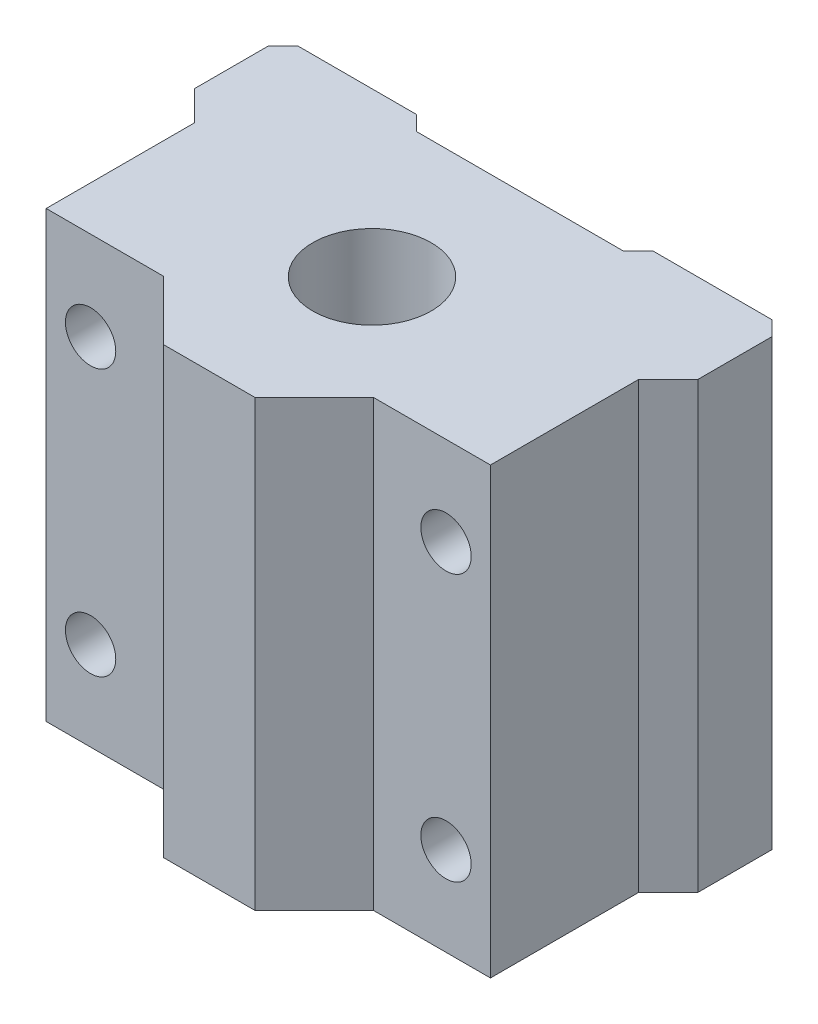
ISO-10303-21;
HEADER;
FILE_DESCRIPTION(('STEP AP214'),'2;1');
FILE_NAME('part.step','',(''),(''),'','','');
FILE_SCHEMA(('AUTOMOTIVE_DESIGN { 1 0 10303 214 1 1 1 1 }'));
ENDSEC;
DATA;
#1=APPLICATION_CONTEXT('core data for automotive mechanical design processes');
#2=APPLICATION_PROTOCOL_DEFINITION('international standard','automotive_design',2000,#1);
#3=PRODUCT_CONTEXT('',#1,'mechanical');
#4=PRODUCT('Part','Part','',(#3));
#5=PRODUCT_RELATED_PRODUCT_CATEGORY('part','',(#4));
#6=PRODUCT_DEFINITION_FORMATION('','',#4);
#7=PRODUCT_DEFINITION_CONTEXT('part definition',#1,'design');
#8=PRODUCT_DEFINITION('design','',#6,#7);
#9=PRODUCT_DEFINITION_SHAPE('','',#8);
#10=(LENGTH_UNIT() NAMED_UNIT(*) SI_UNIT(.MILLI.,.METRE.));
#11=(NAMED_UNIT(*) PLANE_ANGLE_UNIT() SI_UNIT($,.RADIAN.));
#12=(NAMED_UNIT(*) SI_UNIT($,.STERADIAN.) SOLID_ANGLE_UNIT());
#13=UNCERTAINTY_MEASURE_WITH_UNIT(LENGTH_MEASURE(1.E-05),#10,'distance_accuracy_value','');
#14=(GEOMETRIC_REPRESENTATION_CONTEXT(3) GLOBAL_UNCERTAINTY_ASSIGNED_CONTEXT((#13)) GLOBAL_UNIT_ASSIGNED_CONTEXT((#10,
#11,#12)) REPRESENTATION_CONTEXT('',''));
#15=CARTESIAN_POINT('',(0.,0.,0.));
#16=DIRECTION('',(0.,0.,1.));
#17=DIRECTION('',(1.,0.,0.));
#18=AXIS2_PLACEMENT_3D('',#15,#16,#17);
#19=CARTESIAN_POINT('',(0.,30.,0.));
#20=DIRECTION('',(0.,1.,0.));
#21=DIRECTION('',(0.,0.,1.));
#22=AXIS2_PLACEMENT_3D('',#19,#20,#21);
#23=PLANE('',#22);
#24=DIRECTION('',(-0.707106781186547,0.,-0.707106781186548));
#25=VECTOR('',#24,1.);
#26=CARTESIAN_POINT('',(-7.,30.,-10.));
#27=LINE('',#26,#25);
#28=CARTESIAN_POINT('',(-7.,30.,-10.));
#29=VERTEX_POINT('',#28);
#30=CARTESIAN_POINT('',(-8.,30.,-11.));
#31=VERTEX_POINT('',#30);
#32=EDGE_CURVE('E231',#29,#31,#27,.T.);
#33=ORIENTED_EDGE('',*,*,#32,.T.);
#34=DIRECTION('',(-1.,0.,0.));
#35=VECTOR('',#34,1.);
#36=CARTESIAN_POINT('',(-8.,30.,-11.));
#37=LINE('',#36,#35);
#38=CARTESIAN_POINT('',(-16.,30.,-11.));
#39=VERTEX_POINT('',#38);
#40=EDGE_CURVE('E129',#31,#39,#37,.T.);
#41=ORIENTED_EDGE('',*,*,#40,.T.);
#42=DIRECTION('',(-0.707106781186546,0.,0.707106781186549));
#43=VECTOR('',#42,1.);
#44=CARTESIAN_POINT('',(-16.,30.,-11.));
#45=LINE('',#44,#43);
#46=CARTESIAN_POINT('',(-17.,30.,-10.));
#47=VERTEX_POINT('',#46);
#48=EDGE_CURVE('E276',#39,#47,#45,.T.);
#49=ORIENTED_EDGE('',*,*,#48,.T.);
#50=DIRECTION('',(0.,0.,1.));
#51=VECTOR('',#50,1.);
#52=CARTESIAN_POINT('',(-17.,30.,-10.));
#53=LINE('',#52,#51);
#54=CARTESIAN_POINT('',(-17.,30.,-5.));
#55=VERTEX_POINT('',#54);
#56=EDGE_CURVE('E295',#47,#55,#53,.T.);
#57=ORIENTED_EDGE('',*,*,#56,.T.);
#58=DIRECTION('',(0.707106781186549,0.,0.707106781186546));
#59=VECTOR('',#58,1.);
#60=CARTESIAN_POINT('',(-17.,30.,-5.));
#61=LINE('',#60,#59);
#62=CARTESIAN_POINT('',(-15.,30.,-3.));
#63=VERTEX_POINT('',#62);
#64=EDGE_CURVE('E292',#55,#63,#61,.T.);
#65=ORIENTED_EDGE('',*,*,#64,.T.);
#66=DIRECTION('',(0.,0.,1.));
#67=VECTOR('',#66,1.);
#68=CARTESIAN_POINT('',(-15.,30.,-3.));
#69=LINE('',#68,#67);
#70=CARTESIAN_POINT('',(-15.,30.,7.));
#71=VERTEX_POINT('',#70);
#72=EDGE_CURVE('E294',#63,#71,#69,.T.);
#73=ORIENTED_EDGE('',*,*,#72,.T.);
#74=DIRECTION('',(1.,0.,0.));
#75=VECTOR('',#74,1.);
#76=CARTESIAN_POINT('',(-15.,30.,7.));
#77=LINE('',#76,#75);
#78=CARTESIAN_POINT('',(-7.09128506130848,30.,7.));
#79=VERTEX_POINT('',#78);
#80=EDGE_CURVE('E297',#71,#79,#77,.T.);
#81=ORIENTED_EDGE('',*,*,#80,.T.);
#82=DIRECTION('',(0.707106781186546,0.,0.707106781186549));
#83=VECTOR('',#82,1.);
#84=CARTESIAN_POINT('',(-7.09128506130848,30.,7.));
#85=LINE('',#84,#83);
#86=CARTESIAN_POINT('',(-3.0912850613085,30.,11.));
#87=VERTEX_POINT('',#86);
#88=EDGE_CURVE('E303',#79,#87,#85,.T.);
#89=ORIENTED_EDGE('',*,*,#88,.T.);
#90=DIRECTION('',(1.,0.,0.));
#91=VECTOR('',#90,1.);
#92=CARTESIAN_POINT('',(3.0912850613085,30.,11.));
#93=LINE('',#92,#91);
#94=CARTESIAN_POINT('',(3.0912850613085,30.,11.));
#95=VERTEX_POINT('',#94);
#96=EDGE_CURVE('E305',#87,#95,#93,.T.);
#97=ORIENTED_EDGE('',*,*,#96,.T.);
#98=DIRECTION('',(0.707106781186546,0.,-0.707106781186549));
#99=VECTOR('',#98,1.);
#100=CARTESIAN_POINT('',(7.09128506130848,30.,7.));
#101=LINE('',#100,#99);
#102=CARTESIAN_POINT('',(7.09128506130848,30.,7.));
#103=VERTEX_POINT('',#102);
#104=EDGE_CURVE('E307',#95,#103,#101,.T.);
#105=ORIENTED_EDGE('',*,*,#104,.T.);
#106=DIRECTION('',(1.,0.,0.));
#107=VECTOR('',#106,1.);
#108=CARTESIAN_POINT('',(15.,30.,7.));
#109=LINE('',#108,#107);
#110=CARTESIAN_POINT('',(15.,30.,7.));
#111=VERTEX_POINT('',#110);
#112=EDGE_CURVE('E309',#103,#111,#109,.T.);
#113=ORIENTED_EDGE('',*,*,#112,.T.);
#114=DIRECTION('',(0.,0.,-1.));
#115=VECTOR('',#114,1.);
#116=CARTESIAN_POINT('',(15.,30.,-3.));
#117=LINE('',#116,#115);
#118=CARTESIAN_POINT('',(15.,30.,-3.));
#119=VERTEX_POINT('',#118);
#120=EDGE_CURVE('E311',#111,#119,#117,.T.);
#121=ORIENTED_EDGE('',*,*,#120,.T.);
#122=DIRECTION('',(0.707106781186548,0.,-0.707106781186547));
#123=VECTOR('',#122,1.);
#124=CARTESIAN_POINT('',(17.,30.,-5.));
#125=LINE('',#124,#123);
#126=CARTESIAN_POINT('',(17.,30.,-5.));
#127=VERTEX_POINT('',#126);
#128=EDGE_CURVE('E313',#119,#127,#125,.T.);
#129=ORIENTED_EDGE('',*,*,#128,.T.);
#130=DIRECTION('',(0.,0.,-1.));
#131=VECTOR('',#130,1.);
#132=CARTESIAN_POINT('',(17.,30.,-10.));
#133=LINE('',#132,#131);
#134=CARTESIAN_POINT('',(17.,30.,-10.));
#135=VERTEX_POINT('',#134);
#136=EDGE_CURVE('E315',#127,#135,#133,.T.);
#137=ORIENTED_EDGE('',*,*,#136,.T.);
#138=DIRECTION('',(-0.707106781186546,0.,-0.707106781186549));
#139=VECTOR('',#138,1.);
#140=CARTESIAN_POINT('',(16.,30.,-11.));
#141=LINE('',#140,#139);
#142=CARTESIAN_POINT('',(16.,30.,-11.));
#143=VERTEX_POINT('',#142);
#144=EDGE_CURVE('E178',#135,#143,#141,.T.);
#145=ORIENTED_EDGE('',*,*,#144,.T.);
#146=DIRECTION('',(-1.,0.,0.));
#147=VECTOR('',#146,1.);
#148=CARTESIAN_POINT('',(8.,30.,-11.));
#149=LINE('',#148,#147);
#150=CARTESIAN_POINT('',(8.,30.,-11.));
#151=VERTEX_POINT('',#150);
#152=EDGE_CURVE('E172',#143,#151,#149,.T.);
#153=ORIENTED_EDGE('',*,*,#152,.T.);
#154=DIRECTION('',(-0.707106781186547,0.,0.707106781186548));
#155=VECTOR('',#154,1.);
#156=CARTESIAN_POINT('',(7.,30.,-10.));
#157=LINE('',#156,#155);
#158=CARTESIAN_POINT('',(7.,30.,-10.));
#159=VERTEX_POINT('',#158);
#160=EDGE_CURVE('E176',#151,#159,#157,.T.);
#161=ORIENTED_EDGE('',*,*,#160,.T.);
#162=DIRECTION('',(-1.,0.,0.));
#163=VECTOR('',#162,1.);
#164=CARTESIAN_POINT('',(-7.,30.,-10.));
#165=LINE('',#164,#163);
#166=EDGE_CURVE('E56',#159,#29,#165,.T.);
#167=ORIENTED_EDGE('',*,*,#166,.T.);
#168=EDGE_LOOP('',(#33,#41,#49,#57,#65,#73,#81,#89,#97,#105,#113,#121,#129,#137,#145,#153,#161,#167));
#169=FACE_BOUND('',#168,.T.);
#170=CARTESIAN_POINT('',(0.,30.,0.));
#171=DIRECTION('',(0.,1.,0.));
#172=DIRECTION('',(0.,0.,1.));
#173=AXIS2_PLACEMENT_3D('',#170,#171,#172);
#174=CIRCLE('',#173,4.);
#175=CARTESIAN_POINT('',(0.,30.,4.));
#176=VERTEX_POINT('',#175);
#177=EDGE_CURVE('E200',#176,#176,#174,.T.);
#178=ORIENTED_EDGE('',*,*,#177,.F.);
#179=EDGE_LOOP('',(#178));
#180=FACE_BOUND('',#179,.T.);
#181=ADVANCED_FACE('F39',(#169,#180),#23,.T.);
#182=CARTESIAN_POINT('',(0.,0.,0.));
#183=DIRECTION('',(0.,1.,0.));
#184=DIRECTION('',(0.,0.,1.));
#185=AXIS2_PLACEMENT_3D('',#182,#183,#184);
#186=PLANE('',#185);
#187=DIRECTION('',(-0.707106781186547,0.,-0.707106781186548));
#188=VECTOR('',#187,1.);
#189=CARTESIAN_POINT('',(-7.,0.,-10.));
#190=LINE('',#189,#188);
#191=CARTESIAN_POINT('',(-7.,0.,-10.));
#192=VERTEX_POINT('',#191);
#193=CARTESIAN_POINT('',(-8.,0.,-11.));
#194=VERTEX_POINT('',#193);
#195=EDGE_CURVE('E196',#192,#194,#190,.T.);
#196=ORIENTED_EDGE('',*,*,#195,.F.);
#197=DIRECTION('',(-1.,0.,0.));
#198=VECTOR('',#197,1.);
#199=CARTESIAN_POINT('',(-7.,0.,-10.));
#200=LINE('',#199,#198);
#201=CARTESIAN_POINT('',(7.,0.,-10.));
#202=VERTEX_POINT('',#201);
#203=EDGE_CURVE('E121',#202,#192,#200,.T.);
#204=ORIENTED_EDGE('',*,*,#203,.F.);
#205=DIRECTION('',(-0.707106781186547,0.,0.707106781186548));
#206=VECTOR('',#205,1.);
#207=CARTESIAN_POINT('',(7.,0.,-10.));
#208=LINE('',#207,#206);
#209=CARTESIAN_POINT('',(8.,0.,-11.));
#210=VERTEX_POINT('',#209);
#211=EDGE_CURVE('E115',#210,#202,#208,.T.);
#212=ORIENTED_EDGE('',*,*,#211,.F.);
#213=DIRECTION('',(-1.,0.,0.));
#214=VECTOR('',#213,1.);
#215=CARTESIAN_POINT('',(8.,0.,-11.));
#216=LINE('',#215,#214);
#217=CARTESIAN_POINT('',(16.,0.,-11.));
#218=VERTEX_POINT('',#217);
#219=EDGE_CURVE('E186',#218,#210,#216,.T.);
#220=ORIENTED_EDGE('',*,*,#219,.F.);
#221=DIRECTION('',(-0.707106781186546,0.,-0.707106781186549));
#222=VECTOR('',#221,1.);
#223=CARTESIAN_POINT('',(16.,0.,-11.));
#224=LINE('',#223,#222);
#225=CARTESIAN_POINT('',(17.,0.,-10.));
#226=VERTEX_POINT('',#225);
#227=EDGE_CURVE('E226',#226,#218,#224,.T.);
#228=ORIENTED_EDGE('',*,*,#227,.F.);
#229=DIRECTION('',(0.,0.,-1.));
#230=VECTOR('',#229,1.);
#231=CARTESIAN_POINT('',(17.,0.,-10.));
#232=LINE('',#231,#230);
#233=CARTESIAN_POINT('',(17.,0.,-5.));
#234=VERTEX_POINT('',#233);
#235=EDGE_CURVE('E224',#234,#226,#232,.T.);
#236=ORIENTED_EDGE('',*,*,#235,.F.);
#237=DIRECTION('',(0.707106781186548,0.,-0.707106781186547));
#238=VECTOR('',#237,1.);
#239=CARTESIAN_POINT('',(17.,0.,-5.));
#240=LINE('',#239,#238);
#241=CARTESIAN_POINT('',(15.,0.,-3.));
#242=VERTEX_POINT('',#241);
#243=EDGE_CURVE('E222',#242,#234,#240,.T.);
#244=ORIENTED_EDGE('',*,*,#243,.F.);
#245=DIRECTION('',(0.,0.,-1.));
#246=VECTOR('',#245,1.);
#247=CARTESIAN_POINT('',(15.,0.,-3.));
#248=LINE('',#247,#246);
#249=CARTESIAN_POINT('',(15.,0.,7.));
#250=VERTEX_POINT('',#249);
#251=EDGE_CURVE('E220',#250,#242,#248,.T.);
#252=ORIENTED_EDGE('',*,*,#251,.F.);
#253=DIRECTION('',(1.,0.,0.));
#254=VECTOR('',#253,1.);
#255=CARTESIAN_POINT('',(15.,0.,7.));
#256=LINE('',#255,#254);
#257=CARTESIAN_POINT('',(7.09128506130848,0.,7.));
#258=VERTEX_POINT('',#257);
#259=EDGE_CURVE('E218',#258,#250,#256,.T.);
#260=ORIENTED_EDGE('',*,*,#259,.F.);
#261=DIRECTION('',(0.707106781186546,0.,-0.707106781186549));
#262=VECTOR('',#261,1.);
#263=CARTESIAN_POINT('',(7.09128506130848,0.,7.));
#264=LINE('',#263,#262);
#265=CARTESIAN_POINT('',(3.0912850613085,0.,11.));
#266=VERTEX_POINT('',#265);
#267=EDGE_CURVE('E216',#266,#258,#264,.T.);
#268=ORIENTED_EDGE('',*,*,#267,.F.);
#269=DIRECTION('',(1.,0.,0.));
#270=VECTOR('',#269,1.);
#271=CARTESIAN_POINT('',(3.0912850613085,0.,11.));
#272=LINE('',#271,#270);
#273=CARTESIAN_POINT('',(-3.0912850613085,0.,11.));
#274=VERTEX_POINT('',#273);
#275=EDGE_CURVE('E214',#274,#266,#272,.T.);
#276=ORIENTED_EDGE('',*,*,#275,.F.);
#277=DIRECTION('',(0.707106781186546,0.,0.707106781186549));
#278=VECTOR('',#277,1.);
#279=CARTESIAN_POINT('',(-7.09128506130848,0.,7.));
#280=LINE('',#279,#278);
#281=CARTESIAN_POINT('',(-7.09128506130848,0.,7.));
#282=VERTEX_POINT('',#281);
#283=EDGE_CURVE('E212',#282,#274,#280,.T.);
#284=ORIENTED_EDGE('',*,*,#283,.F.);
#285=DIRECTION('',(1.,0.,0.));
#286=VECTOR('',#285,1.);
#287=CARTESIAN_POINT('',(-15.,0.,7.));
#288=LINE('',#287,#286);
#289=CARTESIAN_POINT('',(-15.,0.,7.));
#290=VERTEX_POINT('',#289);
#291=EDGE_CURVE('E210',#290,#282,#288,.T.);
#292=ORIENTED_EDGE('',*,*,#291,.F.);
#293=DIRECTION('',(0.,0.,1.));
#294=VECTOR('',#293,1.);
#295=CARTESIAN_POINT('',(-15.,0.,-3.));
#296=LINE('',#295,#294);
#297=CARTESIAN_POINT('',(-15.,0.,-3.));
#298=VERTEX_POINT('',#297);
#299=EDGE_CURVE('E208',#298,#290,#296,.T.);
#300=ORIENTED_EDGE('',*,*,#299,.F.);
#301=DIRECTION('',(0.707106781186549,0.,0.707106781186546));
#302=VECTOR('',#301,1.);
#303=CARTESIAN_POINT('',(-17.,0.,-5.));
#304=LINE('',#303,#302);
#305=CARTESIAN_POINT('',(-17.,0.,-5.));
#306=VERTEX_POINT('',#305);
#307=EDGE_CURVE('E206',#306,#298,#304,.T.);
#308=ORIENTED_EDGE('',*,*,#307,.F.);
#309=DIRECTION('',(0.,0.,1.));
#310=VECTOR('',#309,1.);
#311=CARTESIAN_POINT('',(-17.,0.,-10.));
#312=LINE('',#311,#310);
#313=CARTESIAN_POINT('',(-17.,0.,-10.));
#314=VERTEX_POINT('',#313);
#315=EDGE_CURVE('E204',#314,#306,#312,.T.);
#316=ORIENTED_EDGE('',*,*,#315,.F.);
#317=DIRECTION('',(-0.707106781186546,0.,0.707106781186549));
#318=VECTOR('',#317,1.);
#319=CARTESIAN_POINT('',(-16.,0.,-11.));
#320=LINE('',#319,#318);
#321=CARTESIAN_POINT('',(-16.,0.,-11.));
#322=VERTEX_POINT('',#321);
#323=EDGE_CURVE('E202',#322,#314,#320,.T.);
#324=ORIENTED_EDGE('',*,*,#323,.F.);
#325=DIRECTION('',(-1.,0.,0.));
#326=VECTOR('',#325,1.);
#327=CARTESIAN_POINT('',(-8.,0.,-11.));
#328=LINE('',#327,#326);
#329=EDGE_CURVE('E199',#194,#322,#328,.T.);
#330=ORIENTED_EDGE('',*,*,#329,.F.);
#331=EDGE_LOOP('',(#196,#204,#212,#220,#228,#236,#244,#252,#260,#268,#276,#284,#292,#300,#308,
#316,#324,#330));
#332=FACE_BOUND('',#331,.T.);
#333=CARTESIAN_POINT('',(0.,0.,0.));
#334=DIRECTION('',(0.,1.,0.));
#335=DIRECTION('',(0.,0.,1.));
#336=AXIS2_PLACEMENT_3D('',#333,#334,#335);
#337=CIRCLE('',#336,4.);
#338=CARTESIAN_POINT('',(0.,0.,4.));
#339=VERTEX_POINT('',#338);
#340=EDGE_CURVE('E393',#339,#339,#337,.T.);
#341=ORIENTED_EDGE('',*,*,#340,.T.);
#342=EDGE_LOOP('',(#341));
#343=FACE_BOUND('',#342,.T.);
#344=ADVANCED_FACE('F280',(#332,#343),#186,.F.);
#345=CARTESIAN_POINT('',(-7.,30.,-10.));
#346=DIRECTION('',(-0.707106781186548,0.,0.707106781186547));
#347=DIRECTION('',(0.707106781186547,0.,0.707106781186548));
#348=AXIS2_PLACEMENT_3D('',#345,#346,#347);
#349=PLANE('',#348);
#350=ORIENTED_EDGE('',*,*,#195,.T.);
#351=DIRECTION('',(0.,-1.,0.));
#352=VECTOR('',#351,1.);
#353=CARTESIAN_POINT('',(-8.,30.,-11.));
#354=LINE('',#353,#352);
#355=EDGE_CURVE('E11',#31,#194,#354,.T.);
#356=ORIENTED_EDGE('',*,*,#355,.F.);
#357=ORIENTED_EDGE('',*,*,#32,.F.);
#358=DIRECTION('',(0.,-1.,0.));
#359=VECTOR('',#358,1.);
#360=CARTESIAN_POINT('',(-7.,30.,-10.));
#361=LINE('',#360,#359);
#362=EDGE_CURVE('E192',#29,#192,#361,.T.);
#363=ORIENTED_EDGE('',*,*,#362,.T.);
#364=EDGE_LOOP('',(#350,#356,#357,#363));
#365=FACE_BOUND('',#364,.T.);
#366=ADVANCED_FACE('F41',(#365),#349,.F.);
#367=CARTESIAN_POINT('',(-8.,30.,-11.));
#368=DIRECTION('',(0.,0.,1.));
#369=DIRECTION('',(1.,0.,0.));
#370=AXIS2_PLACEMENT_3D('',#367,#368,#369);
#371=PLANE('',#370);
#372=CARTESIAN_POINT('',(-11.9999999999716,5.99999999999999,-11.));
#373=DIRECTION('',(0.,0.,1.));
#374=DIRECTION('',(1.,0.,0.));
#375=AXIS2_PLACEMENT_3D('',#372,#373,#374);
#376=CIRCLE('',#375,1.7);
#377=CARTESIAN_POINT('',(-10.2999999999716,5.99999999999999,-11.));
#378=VERTEX_POINT('',#377);
#379=EDGE_CURVE('E372',#378,#378,#376,.F.);
#380=ORIENTED_EDGE('',*,*,#379,.F.);
#381=EDGE_LOOP('',(#380));
#382=FACE_BOUND('',#381,.T.);
#383=CARTESIAN_POINT('',(-11.9999999999716,24.,-11.));
#384=DIRECTION('',(0.,0.,1.));
#385=DIRECTION('',(1.,0.,0.));
#386=AXIS2_PLACEMENT_3D('',#383,#384,#385);
#387=CIRCLE('',#386,1.7);
#388=CARTESIAN_POINT('',(-10.2999999999716,24.,-11.));
#389=VERTEX_POINT('',#388);
#390=EDGE_CURVE('E367',#389,#389,#387,.F.);
#391=ORIENTED_EDGE('',*,*,#390,.F.);
#392=EDGE_LOOP('',(#391));
#393=FACE_BOUND('',#392,.T.);
#394=ORIENTED_EDGE('',*,*,#329,.T.);
#395=DIRECTION('',(0.,-1.,0.));
#396=VECTOR('',#395,1.);
#397=CARTESIAN_POINT('',(-16.,30.,-11.));
#398=LINE('',#397,#396);
#399=EDGE_CURVE('E48',#39,#322,#398,.T.);
#400=ORIENTED_EDGE('',*,*,#399,.F.);
#401=ORIENTED_EDGE('',*,*,#40,.F.);
#402=ORIENTED_EDGE('',*,*,#355,.T.);
#403=EDGE_LOOP('',(#394,#400,#401,#402));
#404=FACE_BOUND('',#403,.T.);
#405=ADVANCED_FACE('F453',(#382,#393,#404),#371,.F.);
#406=CARTESIAN_POINT('',(-16.,30.,-11.));
#407=DIRECTION('',(0.707106781186549,0.,0.707106781186546));
#408=DIRECTION('',(0.707106781186546,0.,-0.707106781186549));
#409=AXIS2_PLACEMENT_3D('',#406,#407,#408);
#410=PLANE('',#409);
#411=ORIENTED_EDGE('',*,*,#323,.T.);
#412=DIRECTION('',(0.,-1.,0.));
#413=VECTOR('',#412,1.);
#414=CARTESIAN_POINT('',(-17.,30.,-10.));
#415=LINE('',#414,#413);
#416=EDGE_CURVE('E268',#47,#314,#415,.T.);
#417=ORIENTED_EDGE('',*,*,#416,.F.);
#418=ORIENTED_EDGE('',*,*,#48,.F.);
#419=ORIENTED_EDGE('',*,*,#399,.T.);
#420=EDGE_LOOP('',(#411,#417,#418,#419));
#421=FACE_BOUND('',#420,.T.);
#422=ADVANCED_FACE('F274',(#421),#410,.F.);
#423=CARTESIAN_POINT('',(-17.,30.,-10.));
#424=DIRECTION('',(1.,0.,0.));
#425=DIRECTION('',(0.,0.,-1.));
#426=AXIS2_PLACEMENT_3D('',#423,#424,#425);
#427=PLANE('',#426);
#428=ORIENTED_EDGE('',*,*,#315,.T.);
#429=DIRECTION('',(0.,-1.,0.));
#430=VECTOR('',#429,1.);
#431=CARTESIAN_POINT('',(-17.,30.,-5.));
#432=LINE('',#431,#430);
#433=EDGE_CURVE('E265',#55,#306,#432,.T.);
#434=ORIENTED_EDGE('',*,*,#433,.F.);
#435=ORIENTED_EDGE('',*,*,#56,.F.);
#436=ORIENTED_EDGE('',*,*,#416,.T.);
#437=EDGE_LOOP('',(#428,#434,#435,#436));
#438=FACE_BOUND('',#437,.T.);
#439=ADVANCED_FACE('F286',(#438),#427,.F.);
#440=CARTESIAN_POINT('',(-17.,30.,-5.));
#441=DIRECTION('',(0.707106781186546,0.,-0.707106781186549));
#442=DIRECTION('',(-0.707106781186549,0.,-0.707106781186546));
#443=AXIS2_PLACEMENT_3D('',#440,#441,#442);
#444=PLANE('',#443);
#445=ORIENTED_EDGE('',*,*,#307,.T.);
#446=DIRECTION('',(0.,-1.,0.));
#447=VECTOR('',#446,1.);
#448=CARTESIAN_POINT('',(-15.,30.,-3.));
#449=LINE('',#448,#447);
#450=EDGE_CURVE('E262',#63,#298,#449,.T.);
#451=ORIENTED_EDGE('',*,*,#450,.F.);
#452=ORIENTED_EDGE('',*,*,#64,.F.);
#453=ORIENTED_EDGE('',*,*,#433,.T.);
#454=EDGE_LOOP('',(#445,#451,#452,#453));
#455=FACE_BOUND('',#454,.T.);
#456=ADVANCED_FACE('F290',(#455),#444,.F.);
#457=CARTESIAN_POINT('',(-15.,30.,-3.));
#458=DIRECTION('',(1.,0.,0.));
#459=DIRECTION('',(0.,0.,-1.));
#460=AXIS2_PLACEMENT_3D('',#457,#458,#459);
#461=PLANE('',#460);
#462=ORIENTED_EDGE('',*,*,#299,.T.);
#463=DIRECTION('',(0.,-1.,0.));
#464=VECTOR('',#463,1.);
#465=CARTESIAN_POINT('',(-15.,30.,7.));
#466=LINE('',#465,#464);
#467=EDGE_CURVE('E259',#71,#290,#466,.T.);
#468=ORIENTED_EDGE('',*,*,#467,.F.);
#469=ORIENTED_EDGE('',*,*,#72,.F.);
#470=ORIENTED_EDGE('',*,*,#450,.T.);
#471=EDGE_LOOP('',(#462,#468,#469,#470));
#472=FACE_BOUND('',#471,.T.);
#473=ADVANCED_FACE('F443',(#472),#461,.F.);
#474=CARTESIAN_POINT('',(-15.,30.,7.));
#475=DIRECTION('',(0.,0.,-1.));
#476=DIRECTION('',(-1.,0.,0.));
#477=AXIS2_PLACEMENT_3D('',#474,#475,#476);
#478=PLANE('',#477);
#479=CARTESIAN_POINT('',(-11.9999999999716,5.99999999999999,7.));
#480=DIRECTION('',(0.,0.,1.));
#481=DIRECTION('',(1.,0.,0.));
#482=AXIS2_PLACEMENT_3D('',#479,#480,#481);
#483=CIRCLE('',#482,1.7);
#484=CARTESIAN_POINT('',(-10.2999999999716,5.99999999999999,7.));
#485=VERTEX_POINT('',#484);
#486=EDGE_CURVE('E377',#485,#485,#483,.T.);
#487=ORIENTED_EDGE('',*,*,#486,.F.);
#488=EDGE_LOOP('',(#487));
#489=FACE_BOUND('',#488,.T.);
#490=CARTESIAN_POINT('',(-11.9999999999716,24.,7.));
#491=DIRECTION('',(0.,0.,1.));
#492=DIRECTION('',(-1.,0.,0.));
#493=AXIS2_PLACEMENT_3D('',#490,#491,#492);
#494=CIRCLE('',#493,1.7);
#495=CARTESIAN_POINT('',(-13.6999999999716,24.,7.));
#496=VERTEX_POINT('',#495);
#497=EDGE_CURVE('E370',#496,#496,#494,.T.);
#498=ORIENTED_EDGE('',*,*,#497,.F.);
#499=EDGE_LOOP('',(#498));
#500=FACE_BOUND('',#499,.T.);
#501=ORIENTED_EDGE('',*,*,#291,.T.);
#502=DIRECTION('',(0.,-1.,0.));
#503=VECTOR('',#502,1.);
#504=CARTESIAN_POINT('',(-7.09128506130848,30.,7.));
#505=LINE('',#504,#503);
#506=EDGE_CURVE('E256',#79,#282,#505,.T.);
#507=ORIENTED_EDGE('',*,*,#506,.F.);
#508=ORIENTED_EDGE('',*,*,#80,.F.);
#509=ORIENTED_EDGE('',*,*,#467,.T.);
#510=EDGE_LOOP('',(#501,#507,#508,#509));
#511=FACE_BOUND('',#510,.T.);
#512=ADVANCED_FACE('F439',(#489,#500,#511),#478,.F.);
#513=CARTESIAN_POINT('',(-7.09128506130848,30.,7.));
#514=DIRECTION('',(0.707106781186549,0.,-0.707106781186546));
#515=DIRECTION('',(-0.707106781186546,0.,-0.707106781186549));
#516=AXIS2_PLACEMENT_3D('',#513,#514,#515);
#517=PLANE('',#516);
#518=ORIENTED_EDGE('',*,*,#283,.T.);
#519=DIRECTION('',(0.,-1.,0.));
#520=VECTOR('',#519,1.);
#521=CARTESIAN_POINT('',(-3.0912850613085,30.,11.));
#522=LINE('',#521,#520);
#523=EDGE_CURVE('E253',#87,#274,#522,.T.);
#524=ORIENTED_EDGE('',*,*,#523,.F.);
#525=ORIENTED_EDGE('',*,*,#88,.F.);
#526=ORIENTED_EDGE('',*,*,#506,.T.);
#527=EDGE_LOOP('',(#518,#524,#525,#526));
#528=FACE_BOUND('',#527,.T.);
#529=ADVANCED_FACE('F435',(#528),#517,.F.);
#530=CARTESIAN_POINT('',(3.0912850613085,30.,11.));
#531=DIRECTION('',(0.,0.,-1.));
#532=DIRECTION('',(-1.,0.,0.));
#533=AXIS2_PLACEMENT_3D('',#530,#531,#532);
#534=PLANE('',#533);
#535=ORIENTED_EDGE('',*,*,#275,.T.);
#536=DIRECTION('',(0.,-1.,0.));
#537=VECTOR('',#536,1.);
#538=CARTESIAN_POINT('',(3.0912850613085,30.,11.));
#539=LINE('',#538,#537);
#540=EDGE_CURVE('E250',#95,#266,#539,.T.);
#541=ORIENTED_EDGE('',*,*,#540,.F.);
#542=ORIENTED_EDGE('',*,*,#96,.F.);
#543=ORIENTED_EDGE('',*,*,#523,.T.);
#544=EDGE_LOOP('',(#535,#541,#542,#543));
#545=FACE_BOUND('',#544,.T.);
#546=ADVANCED_FACE('F431',(#545),#534,.F.);
#547=CARTESIAN_POINT('',(7.09128506130848,30.,7.));
#548=DIRECTION('',(-0.707106781186549,0.,-0.707106781186546));
#549=DIRECTION('',(-0.707106781186546,0.,0.707106781186549));
#550=AXIS2_PLACEMENT_3D('',#547,#548,#549);
#551=PLANE('',#550);
#552=ORIENTED_EDGE('',*,*,#267,.T.);
#553=DIRECTION('',(0.,-1.,0.));
#554=VECTOR('',#553,1.);
#555=CARTESIAN_POINT('',(7.09128506130848,30.,7.));
#556=LINE('',#555,#554);
#557=EDGE_CURVE('E247',#103,#258,#556,.T.);
#558=ORIENTED_EDGE('',*,*,#557,.F.);
#559=ORIENTED_EDGE('',*,*,#104,.F.);
#560=ORIENTED_EDGE('',*,*,#540,.T.);
#561=EDGE_LOOP('',(#552,#558,#559,#560));
#562=FACE_BOUND('',#561,.T.);
#563=ADVANCED_FACE('F427',(#562),#551,.F.);
#564=CARTESIAN_POINT('',(15.,30.,7.));
#565=DIRECTION('',(0.,0.,-1.));
#566=DIRECTION('',(-1.,0.,0.));
#567=AXIS2_PLACEMENT_3D('',#564,#565,#566);
#568=PLANE('',#567);
#569=CARTESIAN_POINT('',(12.0000000000284,6.,7.));
#570=DIRECTION('',(0.,0.,1.));
#571=DIRECTION('',(-1.,0.,0.));
#572=AXIS2_PLACEMENT_3D('',#569,#570,#571);
#573=CIRCLE('',#572,1.7);
#574=CARTESIAN_POINT('',(10.3000000000284,6.,7.));
#575=VERTEX_POINT('',#574);
#576=EDGE_CURVE('E383',#575,#575,#573,.T.);
#577=ORIENTED_EDGE('',*,*,#576,.F.);
#578=EDGE_LOOP('',(#577));
#579=FACE_BOUND('',#578,.T.);
#580=CARTESIAN_POINT('',(12.0000000000284,24.,7.));
#581=DIRECTION('',(0.,0.,1.));
#582=DIRECTION('',(1.,0.,0.));
#583=AXIS2_PLACEMENT_3D('',#580,#581,#582);
#584=CIRCLE('',#583,1.7);
#585=CARTESIAN_POINT('',(13.7000000000284,24.,7.));
#586=VERTEX_POINT('',#585);
#587=EDGE_CURVE('E374',#586,#586,#584,.T.);
#588=ORIENTED_EDGE('',*,*,#587,.F.);
#589=EDGE_LOOP('',(#588));
#590=FACE_BOUND('',#589,.T.);
#591=ORIENTED_EDGE('',*,*,#259,.T.);
#592=DIRECTION('',(0.,-1.,0.));
#593=VECTOR('',#592,1.);
#594=CARTESIAN_POINT('',(15.,30.,7.));
#595=LINE('',#594,#593);
#596=EDGE_CURVE('E244',#111,#250,#595,.T.);
#597=ORIENTED_EDGE('',*,*,#596,.F.);
#598=ORIENTED_EDGE('',*,*,#112,.F.);
#599=ORIENTED_EDGE('',*,*,#557,.T.);
#600=EDGE_LOOP('',(#591,#597,#598,#599));
#601=FACE_BOUND('',#600,.T.);
#602=ADVANCED_FACE('F423',(#579,#590,#601),#568,.F.);
#603=CARTESIAN_POINT('',(15.,30.,-3.));
#604=DIRECTION('',(-1.,0.,0.));
#605=DIRECTION('',(0.,0.,1.));
#606=AXIS2_PLACEMENT_3D('',#603,#604,#605);
#607=PLANE('',#606);
#608=ORIENTED_EDGE('',*,*,#251,.T.);
#609=DIRECTION('',(0.,-1.,0.));
#610=VECTOR('',#609,1.);
#611=CARTESIAN_POINT('',(15.,30.,-3.));
#612=LINE('',#611,#610);
#613=EDGE_CURVE('E241',#119,#242,#612,.T.);
#614=ORIENTED_EDGE('',*,*,#613,.F.);
#615=ORIENTED_EDGE('',*,*,#120,.F.);
#616=ORIENTED_EDGE('',*,*,#596,.T.);
#617=EDGE_LOOP('',(#608,#614,#615,#616));
#618=FACE_BOUND('',#617,.T.);
#619=ADVANCED_FACE('F419',(#618),#607,.F.);
#620=CARTESIAN_POINT('',(17.,30.,-5.));
#621=DIRECTION('',(-0.707106781186547,0.,-0.707106781186548));
#622=DIRECTION('',(-0.707106781186548,0.,0.707106781186547));
#623=AXIS2_PLACEMENT_3D('',#620,#621,#622);
#624=PLANE('',#623);
#625=ORIENTED_EDGE('',*,*,#243,.T.);
#626=DIRECTION('',(0.,-1.,0.));
#627=VECTOR('',#626,1.);
#628=CARTESIAN_POINT('',(17.,30.,-5.));
#629=LINE('',#628,#627);
#630=EDGE_CURVE('E238',#127,#234,#629,.T.);
#631=ORIENTED_EDGE('',*,*,#630,.F.);
#632=ORIENTED_EDGE('',*,*,#128,.F.);
#633=ORIENTED_EDGE('',*,*,#613,.T.);
#634=EDGE_LOOP('',(#625,#631,#632,#633));
#635=FACE_BOUND('',#634,.T.);
#636=ADVANCED_FACE('F416',(#635),#624,.F.);
#637=CARTESIAN_POINT('',(17.,30.,-10.));
#638=DIRECTION('',(-1.,0.,0.));
#639=DIRECTION('',(0.,0.,1.));
#640=AXIS2_PLACEMENT_3D('',#637,#638,#639);
#641=PLANE('',#640);
#642=ORIENTED_EDGE('',*,*,#235,.T.);
#643=DIRECTION('',(0.,-1.,0.));
#644=VECTOR('',#643,1.);
#645=CARTESIAN_POINT('',(17.,30.,-10.));
#646=LINE('',#645,#644);
#647=EDGE_CURVE('E235',#135,#226,#646,.T.);
#648=ORIENTED_EDGE('',*,*,#647,.F.);
#649=ORIENTED_EDGE('',*,*,#136,.F.);
#650=ORIENTED_EDGE('',*,*,#630,.T.);
#651=EDGE_LOOP('',(#642,#648,#649,#650));
#652=FACE_BOUND('',#651,.T.);
#653=ADVANCED_FACE('F321',(#652),#641,.F.);
#654=CARTESIAN_POINT('',(16.,30.,-11.));
#655=DIRECTION('',(-0.707106781186549,0.,0.707106781186546));
#656=DIRECTION('',(0.707106781186546,0.,0.707106781186549));
#657=AXIS2_PLACEMENT_3D('',#654,#655,#656);
#658=PLANE('',#657);
#659=ORIENTED_EDGE('',*,*,#227,.T.);
#660=DIRECTION('',(0.,-1.,0.));
#661=VECTOR('',#660,1.);
#662=CARTESIAN_POINT('',(16.,30.,-11.));
#663=LINE('',#662,#661);
#664=EDGE_CURVE('E187',#143,#218,#663,.T.);
#665=ORIENTED_EDGE('',*,*,#664,.F.);
#666=ORIENTED_EDGE('',*,*,#144,.F.);
#667=ORIENTED_EDGE('',*,*,#647,.T.);
#668=EDGE_LOOP('',(#659,#665,#666,#667));
#669=FACE_BOUND('',#668,.T.);
#670=ADVANCED_FACE('F325',(#669),#658,.F.);
#671=CARTESIAN_POINT('',(8.,30.,-11.));
#672=DIRECTION('',(0.,0.,1.));
#673=DIRECTION('',(1.,0.,0.));
#674=AXIS2_PLACEMENT_3D('',#671,#672,#673);
#675=PLANE('',#674);
#676=CARTESIAN_POINT('',(12.0000000000284,6.,-11.));
#677=DIRECTION('',(0.,0.,1.));
#678=DIRECTION('',(1.,0.,0.));
#679=AXIS2_PLACEMENT_3D('',#676,#677,#678);
#680=CIRCLE('',#679,1.7);
#681=CARTESIAN_POINT('',(13.7000000000284,6.,-11.));
#682=VERTEX_POINT('',#681);
#683=EDGE_CURVE('E381',#682,#682,#680,.F.);
#684=ORIENTED_EDGE('',*,*,#683,.F.);
#685=EDGE_LOOP('',(#684));
#686=FACE_BOUND('',#685,.T.);
#687=CARTESIAN_POINT('',(12.0000000000284,24.,-11.));
#688=DIRECTION('',(0.,0.,1.));
#689=DIRECTION('',(1.,0.,0.));
#690=AXIS2_PLACEMENT_3D('',#687,#688,#689);
#691=CIRCLE('',#690,1.7);
#692=CARTESIAN_POINT('',(13.7000000000284,24.,-11.));
#693=VERTEX_POINT('',#692);
#694=EDGE_CURVE('E390',#693,#693,#691,.F.);
#695=ORIENTED_EDGE('',*,*,#694,.F.);
#696=EDGE_LOOP('',(#695));
#697=FACE_BOUND('',#696,.T.);
#698=ORIENTED_EDGE('',*,*,#219,.T.);
#699=DIRECTION('',(0.,-1.,0.));
#700=VECTOR('',#699,1.);
#701=CARTESIAN_POINT('',(8.,30.,-11.));
#702=LINE('',#701,#700);
#703=EDGE_CURVE('E183',#151,#210,#702,.T.);
#704=ORIENTED_EDGE('',*,*,#703,.F.);
#705=ORIENTED_EDGE('',*,*,#152,.F.);
#706=ORIENTED_EDGE('',*,*,#664,.T.);
#707=EDGE_LOOP('',(#698,#704,#705,#706));
#708=FACE_BOUND('',#707,.T.);
#709=ADVANCED_FACE('F184',(#686,#697,#708),#675,.F.);
#710=CARTESIAN_POINT('',(7.,30.,-10.));
#711=DIRECTION('',(0.707106781186548,0.,0.707106781186547));
#712=DIRECTION('',(0.707106781186547,0.,-0.707106781186548));
#713=AXIS2_PLACEMENT_3D('',#710,#711,#712);
#714=PLANE('',#713);
#715=ORIENTED_EDGE('',*,*,#211,.T.);
#716=DIRECTION('',(0.,-1.,0.));
#717=VECTOR('',#716,1.);
#718=CARTESIAN_POINT('',(7.,30.,-10.));
#719=LINE('',#718,#717);
#720=EDGE_CURVE('E188',#159,#202,#719,.T.);
#721=ORIENTED_EDGE('',*,*,#720,.F.);
#722=ORIENTED_EDGE('',*,*,#160,.F.);
#723=ORIENTED_EDGE('',*,*,#703,.T.);
#724=EDGE_LOOP('',(#715,#721,#722,#723));
#725=FACE_BOUND('',#724,.T.);
#726=ADVANCED_FACE('F190',(#725),#714,.F.);
#727=CARTESIAN_POINT('',(-7.,30.,-10.));
#728=DIRECTION('',(0.,0.,1.));
#729=DIRECTION('',(1.,0.,0.));
#730=AXIS2_PLACEMENT_3D('',#727,#728,#729);
#731=PLANE('',#730);
#732=ORIENTED_EDGE('',*,*,#203,.T.);
#733=ORIENTED_EDGE('',*,*,#362,.F.);
#734=ORIENTED_EDGE('',*,*,#166,.F.);
#735=ORIENTED_EDGE('',*,*,#720,.T.);
#736=EDGE_LOOP('',(#732,#733,#734,#735));
#737=FACE_BOUND('',#736,.T.);
#738=ADVANCED_FACE('F329',(#737),#731,.F.);
#739=CARTESIAN_POINT('',(0.,30.,0.));
#740=DIRECTION('',(0.,-1.,0.));
#741=DIRECTION('',(0.,0.,-1.));
#742=AXIS2_PLACEMENT_3D('',#739,#740,#741);
#743=CYLINDRICAL_SURFACE('',#742,4.);
#744=ORIENTED_EDGE('',*,*,#177,.T.);
#745=EDGE_LOOP('',(#744));
#746=FACE_BOUND('',#745,.T.);
#747=ORIENTED_EDGE('',*,*,#340,.F.);
#748=EDGE_LOOP('',(#747));
#749=FACE_BOUND('',#748,.T.);
#750=ADVANCED_FACE('F331',(#746,#749),#743,.F.);
#751=CARTESIAN_POINT('',(12.0000000000284,24.,-15.8083261120685));
#752=DIRECTION('',(0.,0.,1.));
#753=DIRECTION('',(1.,0.,0.));
#754=AXIS2_PLACEMENT_3D('',#751,#752,#753);
#755=CYLINDRICAL_SURFACE('',#754,1.7);
#756=ORIENTED_EDGE('',*,*,#694,.T.);
#757=EDGE_LOOP('',(#756));
#758=FACE_BOUND('',#757,.T.);
#759=ORIENTED_EDGE('',*,*,#587,.T.);
#760=EDGE_LOOP('',(#759));
#761=FACE_BOUND('',#760,.T.);
#762=ADVANCED_FACE('F337',(#758,#761),#755,.F.);
#763=CARTESIAN_POINT('',(12.0000000000284,6.,-15.8083261120685));
#764=DIRECTION('',(0.,0.,1.));
#765=DIRECTION('',(1.,0.,0.));
#766=AXIS2_PLACEMENT_3D('',#763,#764,#765);
#767=CYLINDRICAL_SURFACE('',#766,1.7);
#768=ORIENTED_EDGE('',*,*,#683,.T.);
#769=EDGE_LOOP('',(#768));
#770=FACE_BOUND('',#769,.T.);
#771=ORIENTED_EDGE('',*,*,#576,.T.);
#772=EDGE_LOOP('',(#771));
#773=FACE_BOUND('',#772,.T.);
#774=ADVANCED_FACE('F350',(#770,#773),#767,.F.);
#775=CARTESIAN_POINT('',(-11.9999999999716,24.,-15.8083261120685));
#776=DIRECTION('',(0.,0.,1.));
#777=DIRECTION('',(1.,0.,0.));
#778=AXIS2_PLACEMENT_3D('',#775,#776,#777);
#779=CYLINDRICAL_SURFACE('',#778,1.7);
#780=ORIENTED_EDGE('',*,*,#390,.T.);
#781=EDGE_LOOP('',(#780));
#782=FACE_BOUND('',#781,.T.);
#783=ORIENTED_EDGE('',*,*,#497,.T.);
#784=EDGE_LOOP('',(#783));
#785=FACE_BOUND('',#784,.T.);
#786=ADVANCED_FACE('F354',(#782,#785),#779,.F.);
#787=CARTESIAN_POINT('',(-11.9999999999716,5.99999999999999,-15.8083261120685));
#788=DIRECTION('',(0.,0.,1.));
#789=DIRECTION('',(1.,0.,0.));
#790=AXIS2_PLACEMENT_3D('',#787,#788,#789);
#791=CYLINDRICAL_SURFACE('',#790,1.7);
#792=ORIENTED_EDGE('',*,*,#379,.T.);
#793=EDGE_LOOP('',(#792));
#794=FACE_BOUND('',#793,.T.);
#795=ORIENTED_EDGE('',*,*,#486,.T.);
#796=EDGE_LOOP('',(#795));
#797=FACE_BOUND('',#796,.T.);
#798=ADVANCED_FACE('F356',(#794,#797),#791,.F.);
#799=CLOSED_SHELL('',(#181,#344,#366,#405,#422,#439,#456,#473,#512,#529,#546,#563,#602,#619,
#636,#653,#670,#709,#726,#738,#750,#762,#774,#786,#798));
#800=MANIFOLD_SOLID_BREP('B2',#799);
#801=ADVANCED_BREP_SHAPE_REPRESENTATION('',(#18,#800),#14);
#802=SHAPE_DEFINITION_REPRESENTATION(#9,#801);
ENDSEC;
END-ISO-10303-21;
